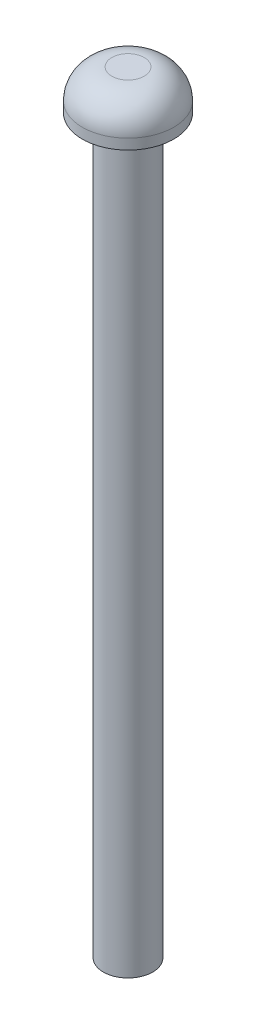
ISO-10303-21;
HEADER;
FILE_DESCRIPTION(('STEP AP214'),'2;1');
FILE_NAME('part.step','',(''),(''),'','','');
FILE_SCHEMA(('AUTOMOTIVE_DESIGN { 1 0 10303 214 1 1 1 1 }'));
ENDSEC;
DATA;
#1=APPLICATION_CONTEXT('core data for automotive mechanical design processes');
#2=APPLICATION_PROTOCOL_DEFINITION('international standard','automotive_design',2000,#1);
#3=PRODUCT_CONTEXT('',#1,'mechanical');
#4=PRODUCT('Part','Part','',(#3));
#5=PRODUCT_RELATED_PRODUCT_CATEGORY('part','',(#4));
#6=PRODUCT_DEFINITION_FORMATION('','',#4);
#7=PRODUCT_DEFINITION_CONTEXT('part definition',#1,'design');
#8=PRODUCT_DEFINITION('design','',#6,#7);
#9=PRODUCT_DEFINITION_SHAPE('','',#8);
#10=(LENGTH_UNIT() NAMED_UNIT(*) SI_UNIT(.MILLI.,.METRE.));
#11=(NAMED_UNIT(*) PLANE_ANGLE_UNIT() SI_UNIT($,.RADIAN.));
#12=(NAMED_UNIT(*) SI_UNIT($,.STERADIAN.) SOLID_ANGLE_UNIT());
#13=UNCERTAINTY_MEASURE_WITH_UNIT(LENGTH_MEASURE(1.E-05),#10,'distance_accuracy_value','');
#14=(GEOMETRIC_REPRESENTATION_CONTEXT(3) GLOBAL_UNCERTAINTY_ASSIGNED_CONTEXT((#13)) GLOBAL_UNIT_ASSIGNED_CONTEXT((#10,
#11,#12)) REPRESENTATION_CONTEXT('',''));
#15=CARTESIAN_POINT('',(0.,0.,0.));
#16=DIRECTION('',(0.,0.,1.));
#17=DIRECTION('',(1.,0.,0.));
#18=AXIS2_PLACEMENT_3D('',#15,#16,#17);
#19=CARTESIAN_POINT('',(0.,-49.65,0.));
#20=DIRECTION('',(0.,1.,0.));
#21=DIRECTION('',(0.,0.,1.));
#22=AXIS2_PLACEMENT_3D('',#19,#20,#21);
#23=CYLINDRICAL_SURFACE('',#22,1.675);
#24=CARTESIAN_POINT('',(0.,-49.65,0.));
#25=DIRECTION('',(0.,1.,0.));
#26=DIRECTION('',(0.,0.,1.));
#27=AXIS2_PLACEMENT_3D('',#24,#25,#26);
#28=CIRCLE('',#27,1.675);
#29=CARTESIAN_POINT('',(0.,-49.65,1.675));
#30=VERTEX_POINT('',#29);
#31=EDGE_CURVE('E50',#30,#30,#28,.T.);
#32=ORIENTED_EDGE('',*,*,#31,.T.);
#33=EDGE_LOOP('',(#32));
#34=FACE_BOUND('',#33,.T.);
#35=CARTESIAN_POINT('',(0.,0.,0.));
#36=DIRECTION('',(0.,1.,0.));
#37=DIRECTION('',(0.,0.,1.));
#38=AXIS2_PLACEMENT_3D('',#35,#36,#37);
#39=CIRCLE('',#38,1.675);
#40=CARTESIAN_POINT('',(0.,0.,1.675));
#41=VERTEX_POINT('',#40);
#42=EDGE_CURVE('E55',#41,#41,#39,.T.);
#43=ORIENTED_EDGE('',*,*,#42,.F.);
#44=EDGE_LOOP('',(#43));
#45=FACE_BOUND('',#44,.T.);
#46=ADVANCED_FACE('F37',(#34,#45),#23,.T.);
#47=CARTESIAN_POINT('',(0.,-49.65,0.));
#48=DIRECTION('',(0.,1.,0.));
#49=DIRECTION('',(0.,0.,1.));
#50=AXIS2_PLACEMENT_3D('',#47,#48,#49);
#51=PLANE('',#50);
#52=ORIENTED_EDGE('',*,*,#31,.F.);
#53=EDGE_LOOP('',(#52));
#54=FACE_BOUND('',#53,.T.);
#55=ADVANCED_FACE('F81',(#54),#51,.F.);
#56=CARTESIAN_POINT('',(0.,2.7,0.));
#57=DIRECTION('',(0.,-1.,0.));
#58=DIRECTION('',(0.,0.,-1.));
#59=AXIS2_PLACEMENT_3D('',#56,#57,#58);
#60=CYLINDRICAL_SURFACE('',#59,3.1);
#61=CARTESIAN_POINT('',(0.,0.699999999999998,0.));
#62=DIRECTION('',(0.,1.,0.));
#63=DIRECTION('',(0.,0.,1.));
#64=AXIS2_PLACEMENT_3D('',#61,#62,#63);
#65=CIRCLE('',#64,3.1);
#66=CARTESIAN_POINT('',(0.,0.699999999999998,-3.1));
#67=VERTEX_POINT('',#66);
#68=EDGE_CURVE('E10',#67,#67,#65,.F.);
#69=CARTESIAN_POINT('',(0.,0.,0.));
#70=DIRECTION('',(0.,1.,0.));
#71=DIRECTION('',(0.,0.,1.));
#72=AXIS2_PLACEMENT_3D('',#69,#70,#71);
#73=CIRCLE('',#72,3.1);
#74=CARTESIAN_POINT('',(0.,0.,-3.1));
#75=VERTEX_POINT('',#74);
#76=EDGE_CURVE('E60',#75,#75,#73,.T.);
#77=CARTESIAN_POINT('',(0.,0.699999999999998,-3.1));
#78=CARTESIAN_POINT('',(0.,0.692708333333331,-3.1));
#79=CARTESIAN_POINT('',(0.,0.685416666666665,-3.1));
#80=CARTESIAN_POINT('',(0.,0.670833333333331,-3.1));
#81=CARTESIAN_POINT('',(0.,0.663541666666665,-3.1));
#82=CARTESIAN_POINT('',(0.,0.648958333333331,-3.1));
#83=CARTESIAN_POINT('',(0.,0.641666666666665,-3.1));
#84=CARTESIAN_POINT('',(0.,0.627083333333331,-3.1));
#85=CARTESIAN_POINT('',(0.,0.619791666666665,-3.1));
#86=CARTESIAN_POINT('',(0.,0.605208333333331,-3.1));
#87=CARTESIAN_POINT('',(0.,0.597916666666665,-3.1));
#88=CARTESIAN_POINT('',(0.,0.583333333333331,-3.1));
#89=CARTESIAN_POINT('',(0.,0.576041666666665,-3.1));
#90=CARTESIAN_POINT('',(0.,0.561458333333332,-3.1));
#91=CARTESIAN_POINT('',(0.,0.554166666666665,-3.1));
#92=CARTESIAN_POINT('',(0.,0.539583333333332,-3.1));
#93=CARTESIAN_POINT('',(0.,0.532291666666665,-3.1));
#94=CARTESIAN_POINT('',(0.,0.517708333333332,-3.1));
#95=CARTESIAN_POINT('',(0.,0.510416666666665,-3.1));
#96=CARTESIAN_POINT('',(0.,0.495833333333332,-3.1));
#97=CARTESIAN_POINT('',(0.,0.488541666666665,-3.1));
#98=CARTESIAN_POINT('',(0.,0.473958333333332,-3.1));
#99=CARTESIAN_POINT('',(0.,0.466666666666665,-3.1));
#100=CARTESIAN_POINT('',(0.,0.452083333333332,-3.1));
#101=CARTESIAN_POINT('',(0.,0.444791666666665,-3.1));
#102=CARTESIAN_POINT('',(0.,0.430208333333332,-3.1));
#103=CARTESIAN_POINT('',(0.,0.422916666666665,-3.1));
#104=CARTESIAN_POINT('',(0.,0.408333333333332,-3.1));
#105=CARTESIAN_POINT('',(0.,0.401041666666665,-3.1));
#106=CARTESIAN_POINT('',(0.,0.386458333333332,-3.1));
#107=CARTESIAN_POINT('',(0.,0.379166666666665,-3.1));
#108=CARTESIAN_POINT('',(0.,0.364583333333332,-3.1));
#109=CARTESIAN_POINT('',(0.,0.357291666666665,-3.1));
#110=CARTESIAN_POINT('',(0.,0.342708333333332,-3.1));
#111=CARTESIAN_POINT('',(0.,0.335416666666666,-3.1));
#112=CARTESIAN_POINT('',(0.,0.320833333333332,-3.1));
#113=CARTESIAN_POINT('',(0.,0.313541666666666,-3.1));
#114=CARTESIAN_POINT('',(0.,0.298958333333332,-3.1));
#115=CARTESIAN_POINT('',(0.,0.291666666666666,-3.1));
#116=CARTESIAN_POINT('',(0.,0.277083333333332,-3.1));
#117=CARTESIAN_POINT('',(0.,0.269791666666666,-3.1));
#118=CARTESIAN_POINT('',(0.,0.255208333333332,-3.1));
#119=CARTESIAN_POINT('',(0.,0.247916666666666,-3.1));
#120=CARTESIAN_POINT('',(0.,0.233333333333332,-3.1));
#121=CARTESIAN_POINT('',(0.,0.226041666666666,-3.1));
#122=CARTESIAN_POINT('',(0.,0.211458333333332,-3.1));
#123=CARTESIAN_POINT('',(0.,0.204166666666666,-3.1));
#124=CARTESIAN_POINT('',(0.,0.189583333333333,-3.1));
#125=CARTESIAN_POINT('',(0.,0.182291666666666,-3.1));
#126=CARTESIAN_POINT('',(0.,0.167708333333333,-3.1));
#127=CARTESIAN_POINT('',(0.,0.160416666666666,-3.1));
#128=CARTESIAN_POINT('',(0.,0.145833333333332,-3.1));
#129=CARTESIAN_POINT('',(0.,0.138541666666666,-3.1));
#130=CARTESIAN_POINT('',(0.,0.123958333333332,-3.1));
#131=CARTESIAN_POINT('',(0.,0.116666666666666,-3.1));
#132=CARTESIAN_POINT('',(0.,0.102083333333333,-3.1));
#133=CARTESIAN_POINT('',(0.,0.0947916666666661,-3.1));
#134=CARTESIAN_POINT('',(0.,0.0802083333333327,-3.1));
#135=CARTESIAN_POINT('',(0.,0.072916666666666,-3.1));
#136=CARTESIAN_POINT('',(0.,0.0583333333333327,-3.1));
#137=CARTESIAN_POINT('',(0.,0.0510416666666661,-3.1));
#138=CARTESIAN_POINT('',(0.,0.0364583333333329,-3.1));
#139=CARTESIAN_POINT('',(0.,0.0291666666666663,-3.1));
#140=CARTESIAN_POINT('',(0.,0.014583333333333,-3.1));
#141=CARTESIAN_POINT('',(0.,0.00729166666666629,-3.1));
#142=CARTESIAN_POINT('',(0.,0.,-3.1));
#143=B_SPLINE_CURVE_WITH_KNOTS('',3,(#77,#78,#79,#80,#81,#82,#83,#84,#85,#86,#87,#88,#89,#90,
#91,#92,#93,#94,#95,#96,#97,#98,#99,#100,#101,#102,#103,#104,#105,#106,#107,#108,#109,#110,#111,
#112,#113,#114,#115,#116,#117,#118,#119,#120,#121,#122,#123,#124,#125,#126,#127,#128,#129,#130,
#131,#132,#133,#134,#135,#136,#137,#138,#139,#140,#141,#142),.UNSPECIFIED.,.F.,.F.,(4,2,2,2,2,2,
2,2,2,2,2,2,2,2,2,2,2,2,2,2,2,2,2,2,2,2,2,2,2,2,2,2,4),(0.,0.0218749999999998,0.04375,
0.0656249999999997,0.0874999999999999,0.109375,0.13125,0.153125,0.175,0.196875,
0.218749999999999,0.240625,0.262499999999999,0.284374999999999,0.306249999999999,
0.328124999999999,0.349999999999999,0.371874999999999,0.393749999999999,0.415624999999999,
0.437499999999999,0.459374999999999,0.481249999999999,0.503124999999999,0.524999999999999,
0.546874999999999,0.568749999999999,0.590624999999999,0.612499999999998,0.634374999999999,
0.656249999999998,0.678124999999998,0.699999999999998),.UNSPECIFIED.);
#144=EDGE_CURVE('BSEAM66',#67,#75,#143,.T.);
#145=ORIENTED_EDGE('',*,*,#68,.T.);
#146=ORIENTED_EDGE('',*,*,#76,.T.);
#147=ORIENTED_EDGE('',*,*,#144,.T.);
#148=ORIENTED_EDGE('',*,*,#144,.F.);
#149=EDGE_LOOP('',(#145,#147,#146,#148));
#150=FACE_BOUND('',#149,.T.);
#151=ADVANCED_FACE('F66',(#150),#60,.T.);
#152=CARTESIAN_POINT('',(0.,2.7,0.));
#153=DIRECTION('',(0.,1.,0.));
#154=DIRECTION('',(0.,0.,1.));
#155=AXIS2_PLACEMENT_3D('',#152,#153,#154);
#156=PLANE('',#155);
#157=CARTESIAN_POINT('',(0.,2.7,0.));
#158=DIRECTION('',(0.,1.,0.));
#159=DIRECTION('',(0.,0.,1.));
#160=AXIS2_PLACEMENT_3D('',#157,#158,#159);
#161=CIRCLE('',#160,1.1);
#162=CARTESIAN_POINT('',(0.,2.7,1.1));
#163=VERTEX_POINT('',#162);
#164=EDGE_CURVE('E45',#163,#163,#161,.T.);
#165=ORIENTED_EDGE('',*,*,#164,.T.);
#166=EDGE_LOOP('',(#165));
#167=FACE_BOUND('',#166,.T.);
#168=ADVANCED_FACE('F70',(#167),#156,.T.);
#169=CARTESIAN_POINT('',(0.,0.,0.));
#170=DIRECTION('',(0.,1.,0.));
#171=DIRECTION('',(0.,0.,1.));
#172=AXIS2_PLACEMENT_3D('',#169,#170,#171);
#173=PLANE('',#172);
#174=ORIENTED_EDGE('',*,*,#42,.T.);
#175=EDGE_LOOP('',(#174));
#176=FACE_BOUND('',#175,.T.);
#177=ORIENTED_EDGE('',*,*,#76,.F.);
#178=EDGE_LOOP('',(#177));
#179=FACE_BOUND('',#178,.T.);
#180=ADVANCED_FACE('F68',(#176,#179),#173,.F.);
#181=CARTESIAN_POINT('',(0.,0.7,0.));
#182=DIRECTION('',(0.,1.,0.));
#183=DIRECTION('',(0.,0.,1.));
#184=AXIS2_PLACEMENT_3D('',#181,#182,#183);
#185=DEGENERATE_TOROIDAL_SURFACE('',#184,1.1,2.,.T.);
#186=ORIENTED_EDGE('',*,*,#68,.F.);
#187=EDGE_LOOP('',(#186));
#188=FACE_BOUND('',#187,.T.);
#189=ORIENTED_EDGE('',*,*,#164,.F.);
#190=EDGE_LOOP('',(#189));
#191=FACE_BOUND('',#190,.T.);
#192=ADVANCED_FACE('F39',(#188,#191),#185,.T.);
#193=CLOSED_SHELL('',(#46,#55,#151,#168,#180,#192));
#194=MANIFOLD_SOLID_BREP('B2',#193);
#195=ADVANCED_BREP_SHAPE_REPRESENTATION('',(#18,#194),#14);
#196=SHAPE_DEFINITION_REPRESENTATION(#9,#195);
ENDSEC;
END-ISO-10303-21;
